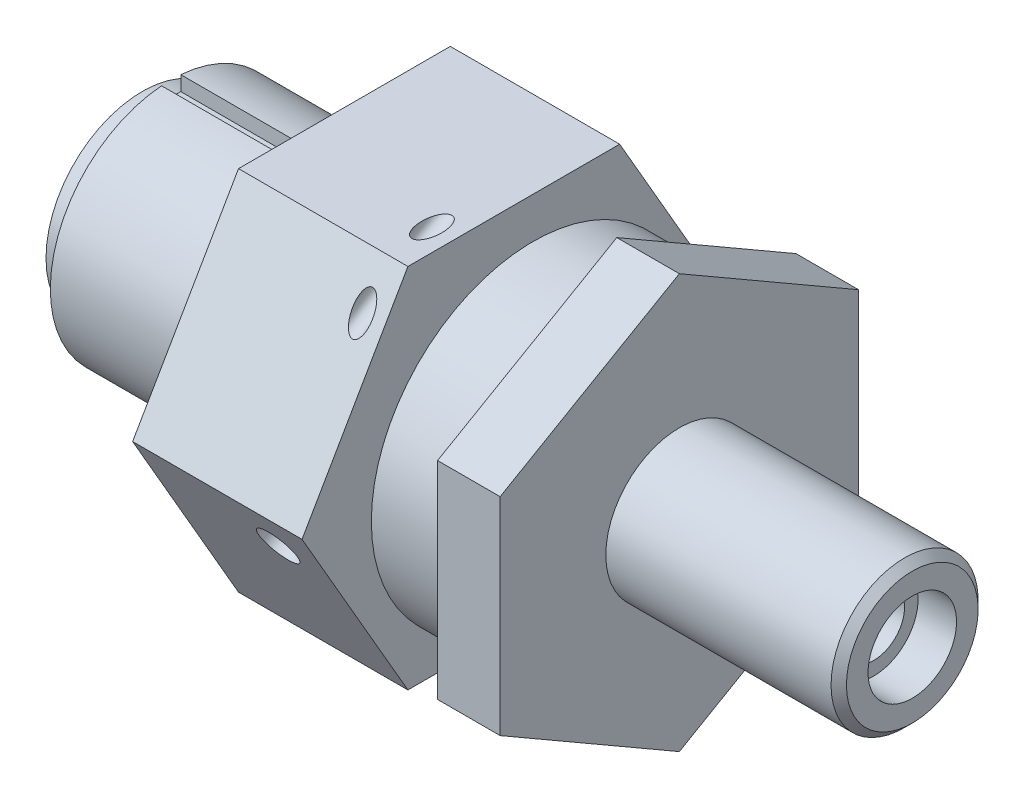
ISO-10303-21;
HEADER;
FILE_DESCRIPTION(('STEP AP214'),'2;1');
FILE_NAME('part.step','',(''),(''),'','','');
FILE_SCHEMA(('AUTOMOTIVE_DESIGN { 1 0 10303 214 1 1 1 1 }'));
ENDSEC;
DATA;
#1=APPLICATION_CONTEXT('core data for automotive mechanical design processes');
#2=APPLICATION_PROTOCOL_DEFINITION('international standard','automotive_design',2000,#1);
#3=PRODUCT_CONTEXT('',#1,'mechanical');
#4=PRODUCT('Part','Part','',(#3));
#5=PRODUCT_RELATED_PRODUCT_CATEGORY('part','',(#4));
#6=PRODUCT_DEFINITION_FORMATION('','',#4);
#7=PRODUCT_DEFINITION_CONTEXT('part definition',#1,'design');
#8=PRODUCT_DEFINITION('design','',#6,#7);
#9=PRODUCT_DEFINITION_SHAPE('','',#8);
#10=(LENGTH_UNIT() NAMED_UNIT(*) SI_UNIT(.MILLI.,.METRE.));
#11=(NAMED_UNIT(*) PLANE_ANGLE_UNIT() SI_UNIT($,.RADIAN.));
#12=(NAMED_UNIT(*) SI_UNIT($,.STERADIAN.) SOLID_ANGLE_UNIT());
#13=UNCERTAINTY_MEASURE_WITH_UNIT(LENGTH_MEASURE(1.E-05),#10,'distance_accuracy_value','');
#14=(GEOMETRIC_REPRESENTATION_CONTEXT(3) GLOBAL_UNCERTAINTY_ASSIGNED_CONTEXT((#13)) GLOBAL_UNIT_ASSIGNED_CONTEXT((#10,
#11,#12)) REPRESENTATION_CONTEXT('',''));
#15=CARTESIAN_POINT('',(0.,0.,0.));
#16=DIRECTION('',(0.,0.,1.));
#17=DIRECTION('',(1.,0.,0.));
#18=AXIS2_PLACEMENT_3D('',#15,#16,#17);
#19=CARTESIAN_POINT('',(10.5,8.75,0.));
#20=DIRECTION('',(1.,0.,0.));
#21=DIRECTION('',(0.,0.,-1.));
#22=AXIS2_PLACEMENT_3D('',#19,#20,#21);
#23=PLANE('',#22);
#24=CARTESIAN_POINT('',(10.5,0.,0.));
#25=DIRECTION('',(-1.,0.,0.));
#26=DIRECTION('',(0.,0.,1.));
#27=AXIS2_PLACEMENT_3D('',#24,#25,#26);
#28=CIRCLE('',#27,8.75);
#29=CARTESIAN_POINT('',(10.5,0.,8.75));
#30=VERTEX_POINT('',#29);
#31=EDGE_CURVE('E322',#30,#30,#28,.T.);
#32=ORIENTED_EDGE('',*,*,#31,.F.);
#33=EDGE_LOOP('',(#32));
#34=FACE_BOUND('',#33,.T.);
#35=DIRECTION('',(0.,-0.866025403784439,-0.5));
#36=VECTOR('',#35,1.);
#37=CARTESIAN_POINT('',(10.5,0.,-11.));
#38=LINE('',#37,#36);
#39=CARTESIAN_POINT('',(10.5,9.52627944162882,-5.5));
#40=VERTEX_POINT('',#39);
#41=CARTESIAN_POINT('',(10.5,0.,-11.));
#42=VERTEX_POINT('',#41);
#43=EDGE_CURVE('E198',#40,#42,#38,.T.);
#44=ORIENTED_EDGE('',*,*,#43,.T.);
#45=DIRECTION('',(0.,-0.866025403784439,0.5));
#46=VECTOR('',#45,1.);
#47=CARTESIAN_POINT('',(10.5,-9.52627944162883,-5.5));
#48=LINE('',#47,#46);
#49=CARTESIAN_POINT('',(10.5,-9.52627944162883,-5.5));
#50=VERTEX_POINT('',#49);
#51=EDGE_CURVE('E236',#42,#50,#48,.T.);
#52=ORIENTED_EDGE('',*,*,#51,.T.);
#53=DIRECTION('',(0.,0.,1.));
#54=VECTOR('',#53,1.);
#55=CARTESIAN_POINT('',(10.5,-9.52627944162883,5.49999999999999));
#56=LINE('',#55,#54);
#57=CARTESIAN_POINT('',(10.5,-9.52627944162883,5.49999999999999));
#58=VERTEX_POINT('',#57);
#59=EDGE_CURVE('E222',#50,#58,#56,.T.);
#60=ORIENTED_EDGE('',*,*,#59,.T.);
#61=DIRECTION('',(0.,0.866025403784438,0.5));
#62=VECTOR('',#61,1.);
#63=CARTESIAN_POINT('',(10.5,0.,11.));
#64=LINE('',#63,#62);
#65=CARTESIAN_POINT('',(10.5,0.,11.));
#66=VERTEX_POINT('',#65);
#67=EDGE_CURVE('E202',#58,#66,#64,.T.);
#68=ORIENTED_EDGE('',*,*,#67,.T.);
#69=DIRECTION('',(0.,0.866025403784439,-0.5));
#70=VECTOR('',#69,1.);
#71=CARTESIAN_POINT('',(10.5,9.52627944162882,5.5));
#72=LINE('',#71,#70);
#73=CARTESIAN_POINT('',(10.5,9.52627944162882,5.5));
#74=VERTEX_POINT('',#73);
#75=EDGE_CURVE('E213',#66,#74,#72,.T.);
#76=ORIENTED_EDGE('',*,*,#75,.T.);
#77=DIRECTION('',(0.,0.,-1.));
#78=VECTOR('',#77,1.);
#79=CARTESIAN_POINT('',(10.5,9.52627944162882,-5.5));
#80=LINE('',#79,#78);
#81=EDGE_CURVE('E218',#74,#40,#80,.T.);
#82=ORIENTED_EDGE('',*,*,#81,.T.);
#83=EDGE_LOOP('',(#44,#52,#60,#68,#76,#82));
#84=FACE_BOUND('',#83,.T.);
#85=ADVANCED_FACE('F43',(#34,#84),#23,.F.);
#86=CARTESIAN_POINT('',(19.3,11.,0.));
#87=DIRECTION('',(-1.,0.,0.));
#88=DIRECTION('',(0.,0.,1.));
#89=AXIS2_PLACEMENT_3D('',#86,#87,#88);
#90=PLANE('',#89);
#91=CARTESIAN_POINT('',(19.3,0.,0.));
#92=DIRECTION('',(-1.,0.,0.));
#93=DIRECTION('',(0.,0.,1.));
#94=AXIS2_PLACEMENT_3D('',#91,#92,#93);
#95=CIRCLE('',#94,6.5);
#96=CARTESIAN_POINT('',(19.3,0.,6.5));
#97=VERTEX_POINT('',#96);
#98=EDGE_CURVE('E319',#97,#97,#95,.T.);
#99=ORIENTED_EDGE('',*,*,#98,.T.);
#100=EDGE_LOOP('',(#99));
#101=FACE_BOUND('',#100,.T.);
#102=DIRECTION('',(0.,0.866025403784439,0.5));
#103=VECTOR('',#102,1.);
#104=CARTESIAN_POINT('',(19.3,0.,-11.));
#105=LINE('',#104,#103);
#106=CARTESIAN_POINT('',(19.3,0.,-11.));
#107=VERTEX_POINT('',#106);
#108=CARTESIAN_POINT('',(19.3,9.52627944162883,-5.5));
#109=VERTEX_POINT('',#108);
#110=EDGE_CURVE('E194',#107,#109,#105,.T.);
#111=ORIENTED_EDGE('',*,*,#110,.T.);
#112=DIRECTION('',(0.,0.,1.));
#113=VECTOR('',#112,1.);
#114=CARTESIAN_POINT('',(19.3,9.52627944162882,-5.5));
#115=LINE('',#114,#113);
#116=CARTESIAN_POINT('',(19.3,9.52627944162882,5.5));
#117=VERTEX_POINT('',#116);
#118=EDGE_CURVE('E219',#109,#117,#115,.T.);
#119=ORIENTED_EDGE('',*,*,#118,.T.);
#120=DIRECTION('',(0.,-0.866025403784439,0.5));
#121=VECTOR('',#120,1.);
#122=CARTESIAN_POINT('',(19.3,9.52627944162882,5.5));
#123=LINE('',#122,#121);
#124=CARTESIAN_POINT('',(19.3,0.,11.));
#125=VERTEX_POINT('',#124);
#126=EDGE_CURVE('E67',#117,#125,#123,.T.);
#127=ORIENTED_EDGE('',*,*,#126,.T.);
#128=DIRECTION('',(0.,-0.866025403784438,-0.5));
#129=VECTOR('',#128,1.);
#130=CARTESIAN_POINT('',(19.3,0.,11.));
#131=LINE('',#130,#129);
#132=CARTESIAN_POINT('',(19.3,-9.52627944162883,5.49999999999999));
#133=VERTEX_POINT('',#132);
#134=EDGE_CURVE('E205',#125,#133,#131,.T.);
#135=ORIENTED_EDGE('',*,*,#134,.T.);
#136=DIRECTION('',(0.,0.,-1.));
#137=VECTOR('',#136,1.);
#138=CARTESIAN_POINT('',(19.3,-9.52627944162883,5.49999999999999));
#139=LINE('',#138,#137);
#140=CARTESIAN_POINT('',(19.3,-9.52627944162883,-5.5));
#141=VERTEX_POINT('',#140);
#142=EDGE_CURVE('E229',#133,#141,#139,.T.);
#143=ORIENTED_EDGE('',*,*,#142,.T.);
#144=DIRECTION('',(0.,0.866025403784439,-0.5));
#145=VECTOR('',#144,1.);
#146=CARTESIAN_POINT('',(19.3,-9.52627944162883,-5.5));
#147=LINE('',#146,#145);
#148=EDGE_CURVE('E239',#141,#107,#147,.T.);
#149=ORIENTED_EDGE('',*,*,#148,.T.);
#150=EDGE_LOOP('',(#111,#119,#127,#135,#143,#149));
#151=FACE_BOUND('',#150,.T.);
#152=ADVANCED_FACE('F363',(#101,#151),#90,.F.);
#153=CARTESIAN_POINT('',(24.65,8.4,0.));
#154=DIRECTION('',(1.,0.,0.));
#155=DIRECTION('',(0.,0.,-1.));
#156=AXIS2_PLACEMENT_3D('',#153,#154,#155);
#157=PLANE('',#156);
#158=CARTESIAN_POINT('',(24.65,0.,0.));
#159=DIRECTION('',(-1.,0.,0.));
#160=DIRECTION('',(0.,0.,1.));
#161=AXIS2_PLACEMENT_3D('',#158,#159,#160);
#162=CIRCLE('',#161,8.4);
#163=CARTESIAN_POINT('',(24.65,0.,8.4));
#164=VERTEX_POINT('',#163);
#165=EDGE_CURVE('E310',#164,#164,#162,.T.);
#166=ORIENTED_EDGE('',*,*,#165,.F.);
#167=EDGE_LOOP('',(#166));
#168=FACE_BOUND('',#167,.T.);
#169=DIRECTION('',(0.,-1.,0.));
#170=VECTOR('',#169,1.);
#171=CARTESIAN_POINT('',(24.65,-5.375,-9.30977309068271));
#172=LINE('',#171,#170);
#173=CARTESIAN_POINT('',(24.65,5.375,-9.30977309068271));
#174=VERTEX_POINT('',#173);
#175=CARTESIAN_POINT('',(24.65,-5.375,-9.30977309068271));
#176=VERTEX_POINT('',#175);
#177=EDGE_CURVE('E247',#174,#176,#172,.T.);
#178=ORIENTED_EDGE('',*,*,#177,.T.);
#179=DIRECTION('',(0.,-0.5,0.866025403784439));
#180=VECTOR('',#179,1.);
#181=CARTESIAN_POINT('',(24.65,-10.75,0.));
#182=LINE('',#181,#180);
#183=CARTESIAN_POINT('',(24.65,-10.75,0.));
#184=VERTEX_POINT('',#183);
#185=EDGE_CURVE('E289',#176,#184,#182,.T.);
#186=ORIENTED_EDGE('',*,*,#185,.T.);
#187=DIRECTION('',(0.,0.5,0.866025403784439));
#188=VECTOR('',#187,1.);
#189=CARTESIAN_POINT('',(24.65,-5.375,9.30977309068271));
#190=LINE('',#189,#188);
#191=CARTESIAN_POINT('',(24.65,-5.37500000000001,9.30977309068271));
#192=VERTEX_POINT('',#191);
#193=EDGE_CURVE('E272',#184,#192,#190,.T.);
#194=ORIENTED_EDGE('',*,*,#193,.T.);
#195=DIRECTION('',(0.,1.,0.));
#196=VECTOR('',#195,1.);
#197=CARTESIAN_POINT('',(24.65,5.375,9.30977309068271));
#198=LINE('',#197,#196);
#199=CARTESIAN_POINT('',(24.65,5.375,9.30977309068272));
#200=VERTEX_POINT('',#199);
#201=EDGE_CURVE('E251',#192,#200,#198,.T.);
#202=ORIENTED_EDGE('',*,*,#201,.T.);
#203=DIRECTION('',(0.,0.5,-0.866025403784438));
#204=VECTOR('',#203,1.);
#205=CARTESIAN_POINT('',(24.65,10.75,0.));
#206=LINE('',#205,#204);
#207=CARTESIAN_POINT('',(24.65,10.75,0.));
#208=VERTEX_POINT('',#207);
#209=EDGE_CURVE('E262',#200,#208,#206,.T.);
#210=ORIENTED_EDGE('',*,*,#209,.T.);
#211=DIRECTION('',(0.,-0.5,-0.866025403784439));
#212=VECTOR('',#211,1.);
#213=CARTESIAN_POINT('',(24.65,5.375,-9.30977309068271));
#214=LINE('',#213,#212);
#215=EDGE_CURVE('E273',#208,#174,#214,.T.);
#216=ORIENTED_EDGE('',*,*,#215,.T.);
#217=EDGE_LOOP('',(#178,#186,#194,#202,#210,#216));
#218=FACE_BOUND('',#217,.T.);
#219=ADVANCED_FACE('F370',(#168,#218),#157,.F.);
#220=CARTESIAN_POINT('',(27.9,10.75,0.));
#221=DIRECTION('',(-1.,0.,0.));
#222=DIRECTION('',(0.,0.,1.));
#223=AXIS2_PLACEMENT_3D('',#220,#221,#222);
#224=PLANE('',#223);
#225=CARTESIAN_POINT('',(27.9,0.,0.));
#226=DIRECTION('',(-1.,0.,0.));
#227=DIRECTION('',(0.,0.,1.));
#228=AXIS2_PLACEMENT_3D('',#225,#226,#227);
#229=CIRCLE('',#228,3.82);
#230=CARTESIAN_POINT('',(27.9,0.,3.82));
#231=VERTEX_POINT('',#230);
#232=EDGE_CURVE('E307',#231,#231,#229,.T.);
#233=ORIENTED_EDGE('',*,*,#232,.T.);
#234=EDGE_LOOP('',(#233));
#235=FACE_BOUND('',#234,.T.);
#236=DIRECTION('',(0.,1.,0.));
#237=VECTOR('',#236,1.);
#238=CARTESIAN_POINT('',(27.9,-5.375,-9.30977309068271));
#239=LINE('',#238,#237);
#240=CARTESIAN_POINT('',(27.9,-5.375,-9.30977309068271));
#241=VERTEX_POINT('',#240);
#242=CARTESIAN_POINT('',(27.9,5.375,-9.30977309068271));
#243=VERTEX_POINT('',#242);
#244=EDGE_CURVE('E243',#241,#243,#239,.T.);
#245=ORIENTED_EDGE('',*,*,#244,.T.);
#246=DIRECTION('',(0.,0.5,0.866025403784439));
#247=VECTOR('',#246,1.);
#248=CARTESIAN_POINT('',(27.9,5.375,-9.30977309068271));
#249=LINE('',#248,#247);
#250=CARTESIAN_POINT('',(27.9,10.75,0.));
#251=VERTEX_POINT('',#250);
#252=EDGE_CURVE('E269',#243,#251,#249,.T.);
#253=ORIENTED_EDGE('',*,*,#252,.T.);
#254=DIRECTION('',(0.,-0.5,0.866025403784439));
#255=VECTOR('',#254,1.);
#256=CARTESIAN_POINT('',(27.9,10.75,0.));
#257=LINE('',#256,#255);
#258=CARTESIAN_POINT('',(27.9,5.37499999999999,9.30977309068272));
#259=VERTEX_POINT('',#258);
#260=EDGE_CURVE('E263',#251,#259,#257,.T.);
#261=ORIENTED_EDGE('',*,*,#260,.T.);
#262=DIRECTION('',(0.,-1.,0.));
#263=VECTOR('',#262,1.);
#264=CARTESIAN_POINT('',(27.9,5.375,9.30977309068271));
#265=LINE('',#264,#263);
#266=CARTESIAN_POINT('',(27.9,-5.375,9.30977309068271));
#267=VERTEX_POINT('',#266);
#268=EDGE_CURVE('E254',#259,#267,#265,.T.);
#269=ORIENTED_EDGE('',*,*,#268,.T.);
#270=DIRECTION('',(0.,-0.5,-0.866025403784439));
#271=VECTOR('',#270,1.);
#272=CARTESIAN_POINT('',(27.9,-5.375,9.30977309068271));
#273=LINE('',#272,#271);
#274=CARTESIAN_POINT('',(27.9,-10.75,0.));
#275=VERTEX_POINT('',#274);
#276=EDGE_CURVE('E282',#267,#275,#273,.T.);
#277=ORIENTED_EDGE('',*,*,#276,.T.);
#278=DIRECTION('',(0.,0.5,-0.866025403784439));
#279=VECTOR('',#278,1.);
#280=CARTESIAN_POINT('',(27.9,-10.75,0.));
#281=LINE('',#280,#279);
#282=EDGE_CURVE('E292',#275,#241,#281,.T.);
#283=ORIENTED_EDGE('',*,*,#282,.T.);
#284=EDGE_LOOP('',(#245,#253,#261,#269,#277,#283));
#285=FACE_BOUND('',#284,.T.);
#286=ADVANCED_FACE('F397',(#235,#285),#224,.F.);
#287=CARTESIAN_POINT('',(0.,0.,0.));
#288=DIRECTION('',(1.,0.,0.));
#289=DIRECTION('',(0.,0.,-1.));
#290=AXIS2_PLACEMENT_3D('',#287,#288,#289);
#291=PLANE('',#290);
#292=CARTESIAN_POINT('',(0.,0.,0.));
#293=DIRECTION('',(-1.,0.,0.));
#294=DIRECTION('',(0.,0.,1.));
#295=AXIS2_PLACEMENT_3D('',#292,#293,#294);
#296=CIRCLE('',#295,5.);
#297=CARTESIAN_POINT('',(0.,0.,5.));
#298=VERTEX_POINT('',#297);
#299=EDGE_CURVE('E336',#298,#298,#296,.T.);
#300=ORIENTED_EDGE('',*,*,#299,.T.);
#301=EDGE_LOOP('',(#300));
#302=FACE_BOUND('',#301,.T.);
#303=ADVANCED_FACE('F394',(#302),#291,.F.);
#304=CARTESIAN_POINT('',(0.,0.,0.));
#305=DIRECTION('',(-1.,0.,0.));
#306=DIRECTION('',(0.,0.,1.));
#307=AXIS2_PLACEMENT_3D('',#304,#305,#306);
#308=CYLINDRICAL_SURFACE('',#307,5.);
#309=ORIENTED_EDGE('',*,*,#299,.F.);
#310=EDGE_LOOP('',(#309));
#311=FACE_BOUND('',#310,.T.);
#312=CARTESIAN_POINT('',(1.5,0.,0.));
#313=DIRECTION('',(-1.,0.,0.));
#314=DIRECTION('',(0.,0.,1.));
#315=AXIS2_PLACEMENT_3D('',#312,#313,#314);
#316=CIRCLE('',#315,5.);
#317=CARTESIAN_POINT('',(1.5,0.,5.));
#318=VERTEX_POINT('',#317);
#319=EDGE_CURVE('E333',#318,#318,#316,.T.);
#320=ORIENTED_EDGE('',*,*,#319,.T.);
#321=EDGE_LOOP('',(#320));
#322=FACE_BOUND('',#321,.T.);
#323=ADVANCED_FACE('F391',(#311,#322),#308,.T.);
#324=CARTESIAN_POINT('',(1.5,5.,0.));
#325=DIRECTION('',(1.,0.,0.));
#326=DIRECTION('',(0.,0.,-1.));
#327=AXIS2_PLACEMENT_3D('',#324,#325,#326);
#328=PLANE('',#327);
#329=ORIENTED_EDGE('',*,*,#319,.F.);
#330=EDGE_LOOP('',(#329));
#331=FACE_BOUND('',#330,.T.);
#332=CARTESIAN_POINT('',(1.5,0.,0.));
#333=DIRECTION('',(-1.,0.,0.));
#334=DIRECTION('',(0.,0.,1.));
#335=AXIS2_PLACEMENT_3D('',#332,#333,#334);
#336=CIRCLE('',#335,6.275);
#337=CARTESIAN_POINT('',(1.5,6.25504796144682,-0.5));
#338=VERTEX_POINT('',#337);
#339=CARTESIAN_POINT('',(1.5,6.25504796144682,0.5));
#340=VERTEX_POINT('',#339);
#341=EDGE_CURVE('E330',#338,#340,#336,.T.);
#342=ORIENTED_EDGE('',*,*,#341,.T.);
#343=DIRECTION('',(0.,1.,0.));
#344=VECTOR('',#343,1.);
#345=CARTESIAN_POINT('',(1.5,6.6358415032681,0.5));
#346=LINE('',#345,#344);
#347=CARTESIAN_POINT('',(1.5,5.49119751435941,0.5));
#348=VERTEX_POINT('',#347);
#349=EDGE_CURVE('E180',#348,#340,#346,.T.);
#350=ORIENTED_EDGE('',*,*,#349,.F.);
#351=DIRECTION('',(0.,0.,1.));
#352=VECTOR('',#351,1.);
#353=CARTESIAN_POINT('',(1.5,5.49119751435941,-0.5));
#354=LINE('',#353,#352);
#355=CARTESIAN_POINT('',(1.5,5.49119751435941,-0.5));
#356=VERTEX_POINT('',#355);
#357=EDGE_CURVE('E175',#356,#348,#354,.T.);
#358=ORIENTED_EDGE('',*,*,#357,.F.);
#359=DIRECTION('',(0.,-1.,0.));
#360=VECTOR('',#359,1.);
#361=CARTESIAN_POINT('',(1.5,6.6358415032681,-0.5));
#362=LINE('',#361,#360);
#363=EDGE_CURVE('E185',#338,#356,#362,.T.);
#364=ORIENTED_EDGE('',*,*,#363,.F.);
#365=EDGE_LOOP('',(#342,#350,#358,#364));
#366=FACE_BOUND('',#365,.T.);
#367=ADVANCED_FACE('F387',(#331,#366),#328,.F.);
#368=CARTESIAN_POINT('',(0.,0.,0.));
#369=DIRECTION('',(-1.,0.,0.));
#370=DIRECTION('',(0.,0.,1.));
#371=AXIS2_PLACEMENT_3D('',#368,#369,#370);
#372=CYLINDRICAL_SURFACE('',#371,6.275);
#373=CARTESIAN_POINT('',(11.,0.,0.));
#374=DIRECTION('',(-1.,0.,0.));
#375=DIRECTION('',(0.,0.,1.));
#376=AXIS2_PLACEMENT_3D('',#373,#374,#375);
#377=CIRCLE('',#376,6.275);
#378=CARTESIAN_POINT('',(11.,6.25504796144682,-0.5));
#379=VERTEX_POINT('',#378);
#380=CARTESIAN_POINT('',(11.,6.25504796144682,0.5));
#381=VERTEX_POINT('',#380);
#382=EDGE_CURVE('E328',#379,#381,#377,.T.);
#383=ORIENTED_EDGE('',*,*,#382,.T.);
#384=DIRECTION('',(-1.,0.,0.));
#385=VECTOR('',#384,1.);
#386=CARTESIAN_POINT('',(0.,6.25504796144682,0.5));
#387=LINE('',#386,#385);
#388=EDGE_CURVE('E163',#381,#340,#387,.T.);
#389=ORIENTED_EDGE('',*,*,#388,.T.);
#390=ORIENTED_EDGE('',*,*,#341,.F.);
#391=DIRECTION('',(-1.,0.,0.));
#392=VECTOR('',#391,1.);
#393=CARTESIAN_POINT('',(0.,6.25504796144682,-0.5));
#394=LINE('',#393,#392);
#395=EDGE_CURVE('E190',#338,#379,#394,.F.);
#396=ORIENTED_EDGE('',*,*,#395,.T.);
#397=EDGE_LOOP('',(#383,#389,#390,#396));
#398=FACE_BOUND('',#397,.T.);
#399=ADVANCED_FACE('F384',(#398),#372,.T.);
#400=CARTESIAN_POINT('',(11.,6.275,0.));
#401=DIRECTION('',(1.,0.,0.));
#402=DIRECTION('',(0.,0.,-1.));
#403=AXIS2_PLACEMENT_3D('',#400,#401,#402);
#404=PLANE('',#403);
#405=ORIENTED_EDGE('',*,*,#382,.F.);
#406=DIRECTION('',(0.,-1.,0.));
#407=VECTOR('',#406,1.);
#408=CARTESIAN_POINT('',(11.,6.6358415032681,-0.5));
#409=LINE('',#408,#407);
#410=CARTESIAN_POINT('',(11.,5.49119751435941,-0.5));
#411=VERTEX_POINT('',#410);
#412=EDGE_CURVE('E59',#379,#411,#409,.T.);
#413=ORIENTED_EDGE('',*,*,#412,.T.);
#414=DIRECTION('',(0.,0.,1.));
#415=VECTOR('',#414,1.);
#416=CARTESIAN_POINT('',(11.,5.49119751435941,-0.5));
#417=LINE('',#416,#415);
#418=CARTESIAN_POINT('',(11.,5.49119751435941,0.5));
#419=VERTEX_POINT('',#418);
#420=EDGE_CURVE('E173',#411,#419,#417,.T.);
#421=ORIENTED_EDGE('',*,*,#420,.T.);
#422=DIRECTION('',(0.,1.,0.));
#423=VECTOR('',#422,1.);
#424=CARTESIAN_POINT('',(11.,6.6358415032681,0.5));
#425=LINE('',#424,#423);
#426=EDGE_CURVE('E157',#419,#381,#425,.T.);
#427=ORIENTED_EDGE('',*,*,#426,.T.);
#428=EDGE_LOOP('',(#405,#413,#421,#427));
#429=FACE_BOUND('',#428,.T.);
#430=CARTESIAN_POINT('',(11.,0.,0.));
#431=DIRECTION('',(-1.,0.,0.));
#432=DIRECTION('',(0.,0.,1.));
#433=AXIS2_PLACEMENT_3D('',#430,#431,#432);
#434=CIRCLE('',#433,8.75);
#435=CARTESIAN_POINT('',(11.,0.,8.75));
#436=VERTEX_POINT('',#435);
#437=EDGE_CURVE('E325',#436,#436,#434,.T.);
#438=ORIENTED_EDGE('',*,*,#437,.T.);
#439=EDGE_LOOP('',(#438));
#440=FACE_BOUND('',#439,.T.);
#441=ADVANCED_FACE('F178',(#429,#440),#404,.F.);
#442=CARTESIAN_POINT('',(0.,0.,0.));
#443=DIRECTION('',(-1.,0.,0.));
#444=DIRECTION('',(0.,0.,1.));
#445=AXIS2_PLACEMENT_3D('',#442,#443,#444);
#446=CYLINDRICAL_SURFACE('',#445,8.75);
#447=ORIENTED_EDGE('',*,*,#437,.F.);
#448=EDGE_LOOP('',(#447));
#449=FACE_BOUND('',#448,.T.);
#450=ORIENTED_EDGE('',*,*,#31,.T.);
#451=EDGE_LOOP('',(#450));
#452=FACE_BOUND('',#451,.T.);
#453=ADVANCED_FACE('F377',(#449,#452),#446,.F.);
#454=CARTESIAN_POINT('',(0.,0.,0.));
#455=DIRECTION('',(-1.,0.,0.));
#456=DIRECTION('',(0.,0.,1.));
#457=AXIS2_PLACEMENT_3D('',#454,#455,#456);
#458=CYLINDRICAL_SURFACE('',#457,6.5);
#459=ORIENTED_EDGE('',*,*,#98,.F.);
#460=EDGE_LOOP('',(#459));
#461=FACE_BOUND('',#460,.T.);
#462=CARTESIAN_POINT('',(20.3,0.,0.));
#463=DIRECTION('',(-1.,0.,0.));
#464=DIRECTION('',(0.,0.,1.));
#465=AXIS2_PLACEMENT_3D('',#462,#463,#464);
#466=CIRCLE('',#465,6.5);
#467=CARTESIAN_POINT('',(20.3,0.,6.5));
#468=VERTEX_POINT('',#467);
#469=EDGE_CURVE('E316',#468,#468,#466,.T.);
#470=ORIENTED_EDGE('',*,*,#469,.T.);
#471=EDGE_LOOP('',(#470));
#472=FACE_BOUND('',#471,.T.);
#473=ADVANCED_FACE('F380',(#461,#472),#458,.T.);
#474=CARTESIAN_POINT('',(20.3,6.5,0.));
#475=DIRECTION('',(1.,0.,0.));
#476=DIRECTION('',(0.,0.,-1.));
#477=AXIS2_PLACEMENT_3D('',#474,#475,#476);
#478=PLANE('',#477);
#479=ORIENTED_EDGE('',*,*,#469,.F.);
#480=EDGE_LOOP('',(#479));
#481=FACE_BOUND('',#480,.T.);
#482=CARTESIAN_POINT('',(20.3,0.,0.));
#483=DIRECTION('',(-1.,0.,0.));
#484=DIRECTION('',(0.,0.,1.));
#485=AXIS2_PLACEMENT_3D('',#482,#483,#484);
#486=CIRCLE('',#485,8.4);
#487=CARTESIAN_POINT('',(20.3,0.,8.4));
#488=VERTEX_POINT('',#487);
#489=EDGE_CURVE('E313',#488,#488,#486,.T.);
#490=ORIENTED_EDGE('',*,*,#489,.T.);
#491=EDGE_LOOP('',(#490));
#492=FACE_BOUND('',#491,.T.);
#493=ADVANCED_FACE('F505',(#481,#492),#478,.F.);
#494=CARTESIAN_POINT('',(0.,0.,0.));
#495=DIRECTION('',(-1.,0.,0.));
#496=DIRECTION('',(0.,0.,1.));
#497=AXIS2_PLACEMENT_3D('',#494,#495,#496);
#498=CYLINDRICAL_SURFACE('',#497,8.4);
#499=ORIENTED_EDGE('',*,*,#489,.F.);
#500=EDGE_LOOP('',(#499));
#501=FACE_BOUND('',#500,.T.);
#502=ORIENTED_EDGE('',*,*,#165,.T.);
#503=EDGE_LOOP('',(#502));
#504=FACE_BOUND('',#503,.T.);
#505=ADVANCED_FACE('F499',(#501,#504),#498,.T.);
#506=CARTESIAN_POINT('',(0.,0.,0.));
#507=DIRECTION('',(-1.,0.,0.));
#508=DIRECTION('',(0.,0.,1.));
#509=AXIS2_PLACEMENT_3D('',#506,#507,#508);
#510=CYLINDRICAL_SURFACE('',#509,3.82);
#511=CARTESIAN_POINT('',(39.6,0.,0.));
#512=DIRECTION('',(-1.,0.,0.));
#513=DIRECTION('',(0.,0.,1.));
#514=AXIS2_PLACEMENT_3D('',#511,#512,#513);
#515=CIRCLE('',#514,3.82);
#516=CARTESIAN_POINT('',(39.6,0.,3.82));
#517=VERTEX_POINT('',#516);
#518=EDGE_CURVE('E52',#517,#517,#515,.T.);
#519=ORIENTED_EDGE('',*,*,#518,.T.);
#520=EDGE_LOOP('',(#519));
#521=FACE_BOUND('',#520,.T.);
#522=ORIENTED_EDGE('',*,*,#232,.F.);
#523=EDGE_LOOP('',(#522));
#524=FACE_BOUND('',#523,.T.);
#525=ADVANCED_FACE('F342',(#521,#524),#510,.T.);
#526=CARTESIAN_POINT('',(40.,3.82,0.));
#527=DIRECTION('',(-1.,0.,0.));
#528=DIRECTION('',(0.,0.,1.));
#529=AXIS2_PLACEMENT_3D('',#526,#527,#528);
#530=PLANE('',#529);
#531=CARTESIAN_POINT('',(40.,0.,0.));
#532=DIRECTION('',(-1.,0.,0.));
#533=DIRECTION('',(0.,0.,1.));
#534=AXIS2_PLACEMENT_3D('',#531,#532,#533);
#535=CIRCLE('',#534,3.41999999999999);
#536=CARTESIAN_POINT('',(40.,0.,3.41999999999999));
#537=VERTEX_POINT('',#536);
#538=EDGE_CURVE('E11',#537,#537,#535,.F.);
#539=ORIENTED_EDGE('',*,*,#538,.T.);
#540=EDGE_LOOP('',(#539));
#541=FACE_BOUND('',#540,.T.);
#542=CARTESIAN_POINT('',(40.,0.,0.));
#543=DIRECTION('',(-1.,0.,0.));
#544=DIRECTION('',(0.,0.,1.));
#545=AXIS2_PLACEMENT_3D('',#542,#543,#544);
#546=CIRCLE('',#545,2.3);
#547=CARTESIAN_POINT('',(40.,0.,2.3));
#548=VERTEX_POINT('',#547);
#549=EDGE_CURVE('E304',#548,#548,#546,.T.);
#550=ORIENTED_EDGE('',*,*,#549,.T.);
#551=EDGE_LOOP('',(#550));
#552=FACE_BOUND('',#551,.T.);
#553=ADVANCED_FACE('F494',(#541,#552),#530,.F.);
#554=CARTESIAN_POINT('',(0.,0.,0.));
#555=DIRECTION('',(-1.,0.,0.));
#556=DIRECTION('',(0.,0.,1.));
#557=AXIS2_PLACEMENT_3D('',#554,#555,#556);
#558=CYLINDRICAL_SURFACE('',#557,2.3);
#559=ORIENTED_EDGE('',*,*,#549,.F.);
#560=EDGE_LOOP('',(#559));
#561=FACE_BOUND('',#560,.T.);
#562=CARTESIAN_POINT('',(38.,0.,0.));
#563=DIRECTION('',(-1.,0.,0.));
#564=DIRECTION('',(0.,0.,1.));
#565=AXIS2_PLACEMENT_3D('',#562,#563,#564);
#566=CIRCLE('',#565,2.3);
#567=CARTESIAN_POINT('',(38.,0.,2.3));
#568=VERTEX_POINT('',#567);
#569=EDGE_CURVE('E301',#568,#568,#566,.T.);
#570=ORIENTED_EDGE('',*,*,#569,.T.);
#571=EDGE_LOOP('',(#570));
#572=FACE_BOUND('',#571,.T.);
#573=ADVANCED_FACE('F490',(#561,#572),#558,.F.);
#574=CARTESIAN_POINT('',(38.,2.3,0.));
#575=DIRECTION('',(-1.,0.,0.));
#576=DIRECTION('',(0.,0.,1.));
#577=AXIS2_PLACEMENT_3D('',#574,#575,#576);
#578=PLANE('',#577);
#579=ORIENTED_EDGE('',*,*,#569,.F.);
#580=EDGE_LOOP('',(#579));
#581=FACE_BOUND('',#580,.T.);
#582=CARTESIAN_POINT('',(38.,0.,0.));
#583=DIRECTION('',(-1.,0.,0.));
#584=DIRECTION('',(0.,0.,1.));
#585=AXIS2_PLACEMENT_3D('',#582,#583,#584);
#586=CIRCLE('',#585,1.6);
#587=CARTESIAN_POINT('',(38.,0.,1.6));
#588=VERTEX_POINT('',#587);
#589=EDGE_CURVE('E298',#588,#588,#586,.T.);
#590=ORIENTED_EDGE('',*,*,#589,.T.);
#591=EDGE_LOOP('',(#590));
#592=FACE_BOUND('',#591,.T.);
#593=ADVANCED_FACE('F486',(#581,#592),#578,.F.);
#594=CARTESIAN_POINT('',(0.,0.,0.));
#595=DIRECTION('',(-1.,0.,0.));
#596=DIRECTION('',(0.,0.,1.));
#597=AXIS2_PLACEMENT_3D('',#594,#595,#596);
#598=CYLINDRICAL_SURFACE('',#597,1.6);
#599=ORIENTED_EDGE('',*,*,#589,.F.);
#600=EDGE_LOOP('',(#599));
#601=FACE_BOUND('',#600,.T.);
#602=CARTESIAN_POINT('',(12.,0.,0.));
#603=DIRECTION('',(-1.,0.,0.));
#604=DIRECTION('',(0.,0.,1.));
#605=AXIS2_PLACEMENT_3D('',#602,#603,#604);
#606=CIRCLE('',#605,1.6);
#607=CARTESIAN_POINT('',(12.,0.,1.6));
#608=VERTEX_POINT('',#607);
#609=EDGE_CURVE('E295',#608,#608,#606,.T.);
#610=ORIENTED_EDGE('',*,*,#609,.T.);
#611=EDGE_LOOP('',(#610));
#612=FACE_BOUND('',#611,.T.);
#613=ADVANCED_FACE('F358',(#601,#612),#598,.F.);
#614=CARTESIAN_POINT('',(12.,1.6,0.));
#615=DIRECTION('',(-1.,0.,0.));
#616=DIRECTION('',(0.,0.,1.));
#617=AXIS2_PLACEMENT_3D('',#614,#615,#616);
#618=PLANE('',#617);
#619=ORIENTED_EDGE('',*,*,#609,.F.);
#620=EDGE_LOOP('',(#619));
#621=FACE_BOUND('',#620,.T.);
#622=ADVANCED_FACE('F347',(#621),#618,.F.);
#623=CARTESIAN_POINT('',(39.6,0.,0.));
#624=DIRECTION('',(-1.,0.,0.));
#625=DIRECTION('',(0.,0.,1.));
#626=AXIS2_PLACEMENT_3D('',#623,#624,#625);
#627=CONICAL_SURFACE('',#626,3.82,0.785398163397452);
#628=ORIENTED_EDGE('',*,*,#538,.F.);
#629=EDGE_LOOP('',(#628));
#630=FACE_BOUND('',#629,.T.);
#631=ORIENTED_EDGE('',*,*,#518,.F.);
#632=EDGE_LOOP('',(#631));
#633=FACE_BOUND('',#632,.T.);
#634=ADVANCED_FACE('F45',(#630,#633),#627,.T.);
#635=CARTESIAN_POINT('',(-0.001000000000001,-10.75,0.));
#636=DIRECTION('',(0.,-0.866025403784439,-0.5));
#637=DIRECTION('',(0.,0.5,-0.866025403784439));
#638=AXIS2_PLACEMENT_3D('',#635,#636,#637);
#639=PLANE('',#638);
#640=DIRECTION('',(-1.,0.,0.));
#641=VECTOR('',#640,1.);
#642=CARTESIAN_POINT('',(0.,-5.375,-9.30977309068271));
#643=LINE('',#642,#641);
#644=EDGE_CURVE('E246',#241,#176,#643,.T.);
#645=ORIENTED_EDGE('',*,*,#644,.F.);
#646=ORIENTED_EDGE('',*,*,#282,.F.);
#647=DIRECTION('',(-1.,0.,0.));
#648=VECTOR('',#647,1.);
#649=CARTESIAN_POINT('',(0.,-10.75,0.));
#650=LINE('',#649,#648);
#651=EDGE_CURVE('E281',#275,#184,#650,.T.);
#652=ORIENTED_EDGE('',*,*,#651,.T.);
#653=ORIENTED_EDGE('',*,*,#185,.F.);
#654=EDGE_LOOP('',(#645,#646,#652,#653));
#655=FACE_BOUND('',#654,.T.);
#656=ADVANCED_FACE('F346',(#655),#639,.T.);
#657=CARTESIAN_POINT('',(-0.001000000000001,-5.375,9.30977309068271));
#658=DIRECTION('',(0.,-0.866025403784439,0.5));
#659=DIRECTION('',(0.,-0.5,-0.866025403784439));
#660=AXIS2_PLACEMENT_3D('',#657,#658,#659);
#661=PLANE('',#660);
#662=ORIENTED_EDGE('',*,*,#651,.F.);
#663=ORIENTED_EDGE('',*,*,#276,.F.);
#664=DIRECTION('',(-1.,0.,0.));
#665=VECTOR('',#664,1.);
#666=CARTESIAN_POINT('',(0.,-5.37500000000001,9.30977309068271));
#667=LINE('',#666,#665);
#668=EDGE_CURVE('E278',#267,#192,#667,.T.);
#669=ORIENTED_EDGE('',*,*,#668,.T.);
#670=ORIENTED_EDGE('',*,*,#193,.F.);
#671=EDGE_LOOP('',(#662,#663,#669,#670));
#672=FACE_BOUND('',#671,.T.);
#673=ADVANCED_FACE('F354',(#672),#661,.T.);
#674=CARTESIAN_POINT('',(-0.001000000000001,5.375,-9.30977309068271));
#675=DIRECTION('',(0.,0.866025403784439,-0.5));
#676=DIRECTION('',(0.,0.5,0.866025403784439));
#677=AXIS2_PLACEMENT_3D('',#674,#675,#676);
#678=PLANE('',#677);
#679=DIRECTION('',(1.,0.,0.));
#680=VECTOR('',#679,1.);
#681=CARTESIAN_POINT('',(-0.001000000000001,10.75,0.));
#682=LINE('',#681,#680);
#683=EDGE_CURVE('E266',#208,#251,#682,.T.);
#684=ORIENTED_EDGE('',*,*,#683,.T.);
#685=ORIENTED_EDGE('',*,*,#252,.F.);
#686=DIRECTION('',(-1.,0.,0.));
#687=VECTOR('',#686,1.);
#688=CARTESIAN_POINT('',(0.,5.37500000000001,-9.30977309068271));
#689=LINE('',#688,#687);
#690=EDGE_CURVE('E242',#243,#174,#689,.T.);
#691=ORIENTED_EDGE('',*,*,#690,.T.);
#692=ORIENTED_EDGE('',*,*,#215,.F.);
#693=EDGE_LOOP('',(#684,#685,#691,#692));
#694=FACE_BOUND('',#693,.T.);
#695=ADVANCED_FACE('F476',(#694),#678,.T.);
#696=CARTESIAN_POINT('',(-0.001000000000001,10.75,0.));
#697=DIRECTION('',(0.,0.866025403784439,0.5));
#698=DIRECTION('',(0.,-0.5,0.866025403784438));
#699=AXIS2_PLACEMENT_3D('',#696,#697,#698);
#700=PLANE('',#699);
#701=DIRECTION('',(1.,0.,0.));
#702=VECTOR('',#701,1.);
#703=CARTESIAN_POINT('',(-0.001000000000001,5.375,9.30977309068271));
#704=LINE('',#703,#702);
#705=EDGE_CURVE('E257',#200,#259,#704,.T.);
#706=ORIENTED_EDGE('',*,*,#705,.T.);
#707=ORIENTED_EDGE('',*,*,#260,.F.);
#708=ORIENTED_EDGE('',*,*,#683,.F.);
#709=ORIENTED_EDGE('',*,*,#209,.F.);
#710=EDGE_LOOP('',(#706,#707,#708,#709));
#711=FACE_BOUND('',#710,.T.);
#712=ADVANCED_FACE('F472',(#711),#700,.T.);
#713=CARTESIAN_POINT('',(-0.001000000000001,5.375,9.30977309068271));
#714=DIRECTION('',(0.,0.,1.));
#715=DIRECTION('',(0.,-1.,0.));
#716=AXIS2_PLACEMENT_3D('',#713,#714,#715);
#717=PLANE('',#716);
#718=ORIENTED_EDGE('',*,*,#668,.F.);
#719=ORIENTED_EDGE('',*,*,#268,.F.);
#720=ORIENTED_EDGE('',*,*,#705,.F.);
#721=ORIENTED_EDGE('',*,*,#201,.F.);
#722=EDGE_LOOP('',(#718,#719,#720,#721));
#723=FACE_BOUND('',#722,.T.);
#724=ADVANCED_FACE('F465',(#723),#717,.T.);
#725=CARTESIAN_POINT('',(-0.001000000000001,-5.375,-9.30977309068271));
#726=DIRECTION('',(0.,0.,-1.));
#727=DIRECTION('',(-1.,0.,0.));
#728=AXIS2_PLACEMENT_3D('',#725,#726,#727);
#729=PLANE('',#728);
#730=ORIENTED_EDGE('',*,*,#690,.F.);
#731=ORIENTED_EDGE('',*,*,#244,.F.);
#732=ORIENTED_EDGE('',*,*,#644,.T.);
#733=ORIENTED_EDGE('',*,*,#177,.F.);
#734=EDGE_LOOP('',(#730,#731,#732,#733));
#735=FACE_BOUND('',#734,.T.);
#736=ADVANCED_FACE('F459',(#735),#729,.T.);
#737=CARTESIAN_POINT('',(-0.001000000000001,-9.52627944162883,-5.5));
#738=DIRECTION('',(0.,-0.5,-0.866025403784439));
#739=DIRECTION('',(0.,0.866025403784439,-0.5));
#740=AXIS2_PLACEMENT_3D('',#737,#738,#739);
#741=PLANE('',#740);
#742=DIRECTION('',(-1.,0.,0.));
#743=VECTOR('',#742,1.);
#744=CARTESIAN_POINT('',(0.,0.,-11.));
#745=LINE('',#744,#743);
#746=EDGE_CURVE('E197',#107,#42,#745,.T.);
#747=ORIENTED_EDGE('',*,*,#746,.F.);
#748=ORIENTED_EDGE('',*,*,#148,.F.);
#749=DIRECTION('',(-1.,0.,0.));
#750=VECTOR('',#749,1.);
#751=CARTESIAN_POINT('',(0.,-9.52627944162883,-5.5));
#752=LINE('',#751,#750);
#753=EDGE_CURVE('E228',#141,#50,#752,.T.);
#754=ORIENTED_EDGE('',*,*,#753,.T.);
#755=ORIENTED_EDGE('',*,*,#51,.F.);
#756=EDGE_LOOP('',(#747,#748,#754,#755));
#757=FACE_BOUND('',#756,.T.);
#758=ADVANCED_FACE('F456',(#757),#741,.T.);
#759=CARTESIAN_POINT('',(-0.001000000000001,-9.52627944162883,5.49999999999999));
#760=DIRECTION('',(0.,-1.,0.));
#761=DIRECTION('',(0.,0.,-1.));
#762=AXIS2_PLACEMENT_3D('',#759,#760,#761);
#763=PLANE('',#762);
#764=ORIENTED_EDGE('',*,*,#753,.F.);
#765=ORIENTED_EDGE('',*,*,#142,.F.);
#766=DIRECTION('',(-1.,0.,0.));
#767=VECTOR('',#766,1.);
#768=CARTESIAN_POINT('',(0.,-9.52627944162883,5.49999999999999));
#769=LINE('',#768,#767);
#770=EDGE_CURVE('E225',#133,#58,#769,.T.);
#771=ORIENTED_EDGE('',*,*,#770,.T.);
#772=ORIENTED_EDGE('',*,*,#59,.F.);
#773=EDGE_LOOP('',(#764,#765,#771,#772));
#774=FACE_BOUND('',#773,.T.);
#775=ADVANCED_FACE('F454',(#774),#763,.T.);
#776=CARTESIAN_POINT('',(-0.001000000000001,9.52627944162882,-5.5));
#777=DIRECTION('',(0.,1.,0.));
#778=DIRECTION('',(0.,0.,1.));
#779=AXIS2_PLACEMENT_3D('',#776,#777,#778);
#780=PLANE('',#779);
#781=CARTESIAN_POINT('',(18.1459978536125,9.52627944162882,3.1));
#782=DIRECTION('',(0.,1.,0.));
#783=DIRECTION('',(0.,0.,1.));
#784=AXIS2_PLACEMENT_3D('',#781,#782,#783);
#785=ELLIPSE('',#784,1.04140766593159,0.520703832965796);
#786=CARTESIAN_POINT('',(18.1459978536125,9.52627944162882,4.14140766593159));
#787=VERTEX_POINT('',#786);
#788=EDGE_CURVE('E411',#787,#787,#785,.T.);
#789=ORIENTED_EDGE('',*,*,#788,.F.);
#790=EDGE_LOOP('',(#789));
#791=FACE_BOUND('',#790,.T.);
#792=DIRECTION('',(1.,0.,0.));
#793=VECTOR('',#792,1.);
#794=CARTESIAN_POINT('',(-0.001000000000001,9.52627944162882,5.5));
#795=LINE('',#794,#793);
#796=EDGE_CURVE('E212',#74,#117,#795,.T.);
#797=ORIENTED_EDGE('',*,*,#796,.T.);
#798=ORIENTED_EDGE('',*,*,#118,.F.);
#799=DIRECTION('',(-1.,0.,0.));
#800=VECTOR('',#799,1.);
#801=CARTESIAN_POINT('',(0.,9.52627944162883,-5.5));
#802=LINE('',#801,#800);
#803=EDGE_CURVE('E193',#109,#40,#802,.T.);
#804=ORIENTED_EDGE('',*,*,#803,.T.);
#805=ORIENTED_EDGE('',*,*,#81,.F.);
#806=EDGE_LOOP('',(#797,#798,#804,#805));
#807=FACE_BOUND('',#806,.T.);
#808=ADVANCED_FACE('F448',(#791,#807),#780,.T.);
#809=CARTESIAN_POINT('',(-0.001000000000001,9.52627944162882,5.5));
#810=DIRECTION('',(0.,0.5,0.866025403784439));
#811=DIRECTION('',(0.,-0.866025403784439,0.5));
#812=AXIS2_PLACEMENT_3D('',#809,#810,#811);
#813=PLANE('',#812);
#814=CARTESIAN_POINT('',(18.1459978536125,7.44781847254617,6.7));
#815=DIRECTION('',(0.,0.5,0.866025403784439));
#816=DIRECTION('',(0.,-0.866025403784439,0.5));
#817=AXIS2_PLACEMENT_3D('',#814,#815,#816);
#818=ELLIPSE('',#817,1.04140766593159,0.520703832965796);
#819=CARTESIAN_POINT('',(18.1459978536125,6.54593297815355,7.2207038329658));
#820=VERTEX_POINT('',#819);
#821=EDGE_CURVE('E47',#820,#820,#818,.T.);
#822=ORIENTED_EDGE('',*,*,#821,.F.);
#823=EDGE_LOOP('',(#822));
#824=FACE_BOUND('',#823,.T.);
#825=DIRECTION('',(1.,0.,0.));
#826=VECTOR('',#825,1.);
#827=CARTESIAN_POINT('',(-0.001000000000001,0.,11.));
#828=LINE('',#827,#826);
#829=EDGE_CURVE('E208',#66,#125,#828,.T.);
#830=ORIENTED_EDGE('',*,*,#829,.T.);
#831=ORIENTED_EDGE('',*,*,#126,.F.);
#832=ORIENTED_EDGE('',*,*,#796,.F.);
#833=ORIENTED_EDGE('',*,*,#75,.F.);
#834=EDGE_LOOP('',(#830,#831,#832,#833));
#835=FACE_BOUND('',#834,.T.);
#836=ADVANCED_FACE('F450',(#824,#835),#813,.T.);
#837=CARTESIAN_POINT('',(-0.001000000000001,0.,11.));
#838=DIRECTION('',(0.,-0.5,0.866025403784438));
#839=DIRECTION('',(0.,-0.866025403784438,-0.5));
#840=AXIS2_PLACEMENT_3D('',#837,#838,#839);
#841=PLANE('',#840);
#842=CARTESIAN_POINT('',(16.8087007078645,-2.17017497707742,9.74704889279576));
#843=DIRECTION('',(0.,-0.5,0.866025403784439));
#844=DIRECTION('',(0.,-0.866025403784439,-0.5));
#845=AXIS2_PLACEMENT_3D('',#842,#843,#844);
#846=CIRCLE('',#845,1.01604367351685);
#847=CARTESIAN_POINT('',(16.8087007078645,-3.05009460969747,9.23902705603734));
#848=VERTEX_POINT('',#847);
#849=EDGE_CURVE('E415',#848,#848,#846,.T.);
#850=ORIENTED_EDGE('',*,*,#849,.F.);
#851=EDGE_LOOP('',(#850));
#852=FACE_BOUND('',#851,.T.);
#853=ORIENTED_EDGE('',*,*,#770,.F.);
#854=ORIENTED_EDGE('',*,*,#134,.F.);
#855=ORIENTED_EDGE('',*,*,#829,.F.);
#856=ORIENTED_EDGE('',*,*,#67,.F.);
#857=EDGE_LOOP('',(#853,#854,#855,#856));
#858=FACE_BOUND('',#857,.T.);
#859=ADVANCED_FACE('F440',(#852,#858),#841,.T.);
#860=CARTESIAN_POINT('',(-0.001000000000001,0.,-11.));
#861=DIRECTION('',(0.,0.5,-0.866025403784439));
#862=DIRECTION('',(0.,0.866025403784439,0.5));
#863=AXIS2_PLACEMENT_3D('',#860,#861,#862);
#864=PLANE('',#863);
#865=CARTESIAN_POINT('',(16.8087007078645,7.3561044645514,-6.75295110720425));
#866=DIRECTION('',(0.,0.499999999999999,-0.866025403784439));
#867=DIRECTION('',(0.,0.866025403784439,0.5));
#868=AXIS2_PLACEMENT_3D('',#865,#866,#867);
#869=CIRCLE('',#868,1.01604367351686);
#870=CARTESIAN_POINT('',(16.8087007078645,8.23602409717146,-6.24492927044582));
#871=VERTEX_POINT('',#870);
#872=EDGE_CURVE('E422',#871,#871,#869,.T.);
#873=ORIENTED_EDGE('',*,*,#872,.F.);
#874=EDGE_LOOP('',(#873));
#875=FACE_BOUND('',#874,.T.);
#876=ORIENTED_EDGE('',*,*,#803,.F.);
#877=ORIENTED_EDGE('',*,*,#110,.F.);
#878=ORIENTED_EDGE('',*,*,#746,.T.);
#879=ORIENTED_EDGE('',*,*,#43,.F.);
#880=EDGE_LOOP('',(#876,#877,#878,#879));
#881=FACE_BOUND('',#880,.T.);
#882=ADVANCED_FACE('F437',(#875,#881),#864,.T.);
#883=CARTESIAN_POINT('',(12.5199374531029,6.6358415032681,0.5));
#884=DIRECTION('',(0.,0.,1.));
#885=DIRECTION('',(0.,-1.,0.));
#886=AXIS2_PLACEMENT_3D('',#883,#884,#885);
#887=PLANE('',#886);
#888=ORIENTED_EDGE('',*,*,#426,.F.);
#889=DIRECTION('',(-1.,0.,0.));
#890=VECTOR('',#889,1.);
#891=CARTESIAN_POINT('',(12.5199374531029,5.49119751435941,0.5));
#892=LINE('',#891,#890);
#893=EDGE_CURVE('E160',#419,#348,#892,.T.);
#894=ORIENTED_EDGE('',*,*,#893,.T.);
#895=ORIENTED_EDGE('',*,*,#349,.T.);
#896=ORIENTED_EDGE('',*,*,#388,.F.);
#897=EDGE_LOOP('',(#888,#894,#895,#896));
#898=FACE_BOUND('',#897,.T.);
#899=ADVANCED_FACE('F159',(#898),#887,.F.);
#900=CARTESIAN_POINT('',(12.5199374531029,6.6358415032681,-0.5));
#901=DIRECTION('',(0.,0.,-1.));
#902=DIRECTION('',(0.,1.,0.));
#903=AXIS2_PLACEMENT_3D('',#900,#901,#902);
#904=PLANE('',#903);
#905=ORIENTED_EDGE('',*,*,#363,.T.);
#906=DIRECTION('',(-1.,0.,0.));
#907=VECTOR('',#906,1.);
#908=CARTESIAN_POINT('',(12.5199374531029,5.49119751435941,-0.5));
#909=LINE('',#908,#907);
#910=EDGE_CURVE('E187',#411,#356,#909,.T.);
#911=ORIENTED_EDGE('',*,*,#910,.F.);
#912=ORIENTED_EDGE('',*,*,#412,.F.);
#913=ORIENTED_EDGE('',*,*,#395,.F.);
#914=EDGE_LOOP('',(#905,#911,#912,#913));
#915=FACE_BOUND('',#914,.T.);
#916=ADVANCED_FACE('F410',(#915),#904,.F.);
#917=CARTESIAN_POINT('',(12.5199374531029,5.49119751435941,-0.5));
#918=DIRECTION('',(0.,-1.,0.));
#919=DIRECTION('',(0.,0.,-1.));
#920=AXIS2_PLACEMENT_3D('',#917,#918,#919);
#921=PLANE('',#920);
#922=ORIENTED_EDGE('',*,*,#910,.T.);
#923=ORIENTED_EDGE('',*,*,#357,.T.);
#924=ORIENTED_EDGE('',*,*,#893,.F.);
#925=ORIENTED_EDGE('',*,*,#420,.F.);
#926=EDGE_LOOP('',(#922,#923,#924,#925));
#927=FACE_BOUND('',#926,.T.);
#928=ADVANCED_FACE('F172',(#927),#921,.F.);
#929=CARTESIAN_POINT('',(18.1459978536125,15.9376886779019,-8.00488654534136));
#930=DIRECTION('',(0.,-0.5,0.866025403784438));
#931=DIRECTION('',(0.,-0.866025403784439,-0.5));
#932=AXIS2_PLACEMENT_3D('',#929,#930,#931);
#933=CYLINDRICAL_SURFACE('',#932,0.520703832965796);
#934=ORIENTED_EDGE('',*,*,#788,.T.);
#935=EDGE_LOOP('',(#934));
#936=FACE_BOUND('',#935,.T.);
#937=ORIENTED_EDGE('',*,*,#821,.T.);
#938=EDGE_LOOP('',(#937));
#939=FACE_BOUND('',#938,.T.);
#940=ADVANCED_FACE('F692',(#936,#939),#933,.F.);
#941=CARTESIAN_POINT('',(16.8087007078645,-1.92017497707742,9.31403619090354));
#942=DIRECTION('',(0.,-0.5,0.866025403784439));
#943=DIRECTION('',(0.,-0.866025403784439,-0.5));
#944=AXIS2_PLACEMENT_3D('',#941,#942,#943);
#945=CYLINDRICAL_SURFACE('',#944,1.01604367351685);
#946=CARTESIAN_POINT('',(16.8087007078645,-1.92017497707742,9.31403619090354));
#947=DIRECTION('',(0.,-0.5,0.866025403784439));
#948=DIRECTION('',(0.,-0.866025403784439,-0.5));
#949=AXIS2_PLACEMENT_3D('',#946,#947,#948);
#950=CIRCLE('',#949,1.01604367351685);
#951=CARTESIAN_POINT('',(16.8087007078645,-2.80009460969747,8.80601435414512));
#952=VERTEX_POINT('',#951);
#953=EDGE_CURVE('E418',#952,#952,#950,.T.);
#954=ORIENTED_EDGE('',*,*,#953,.F.);
#955=EDGE_LOOP('',(#954));
#956=FACE_BOUND('',#955,.T.);
#957=ORIENTED_EDGE('',*,*,#849,.T.);
#958=EDGE_LOOP('',(#957));
#959=FACE_BOUND('',#958,.T.);
#960=ADVANCED_FACE('F700',(#956,#959),#945,.F.);
#961=CARTESIAN_POINT('',(16.8087007078645,-1.92017497707742,9.31403619090354));
#962=DIRECTION('',(0.,-0.5,0.866025403784439));
#963=DIRECTION('',(0.,-0.866025403784439,-0.5));
#964=AXIS2_PLACEMENT_3D('',#961,#962,#963);
#965=PLANE('',#964);
#966=ORIENTED_EDGE('',*,*,#953,.T.);
#967=EDGE_LOOP('',(#966));
#968=FACE_BOUND('',#967,.T.);
#969=ADVANCED_FACE('F433',(#968),#965,.T.);
#970=CARTESIAN_POINT('',(16.8087007078645,7.1061044645514,-6.31993840531203));
#971=DIRECTION('',(0.,0.499999999999999,-0.866025403784439));
#972=DIRECTION('',(0.,0.866025403784439,0.5));
#973=AXIS2_PLACEMENT_3D('',#970,#971,#972);
#974=CYLINDRICAL_SURFACE('',#973,1.01604367351686);
#975=CARTESIAN_POINT('',(16.8087007078645,7.1061044645514,-6.31993840531203));
#976=DIRECTION('',(0.,0.499999999999999,-0.866025403784439));
#977=DIRECTION('',(0.,0.866025403784439,0.5));
#978=AXIS2_PLACEMENT_3D('',#975,#976,#977);
#979=CIRCLE('',#978,1.01604367351686);
#980=CARTESIAN_POINT('',(16.8087007078645,7.98602409717146,-5.8119165685536));
#981=VERTEX_POINT('',#980);
#982=EDGE_CURVE('E419',#981,#981,#979,.T.);
#983=CARTESIAN_POINT('',(16.8087007078645,7.98602409717146,-5.8119165685536));
#984=CARTESIAN_POINT('',(16.8087007078645,7.98862826383813,-5.81642711753164));
#985=CARTESIAN_POINT('',(16.8087007078645,7.99123243050479,-5.82093766650969));
#986=CARTESIAN_POINT('',(16.8087007078645,7.99644076383813,-5.82995876446577));
#987=CARTESIAN_POINT('',(16.8087007078645,7.99904493050479,-5.83446931344382));
#988=CARTESIAN_POINT('',(16.8087007078645,8.00425326383813,-5.84349041139991));
#989=CARTESIAN_POINT('',(16.8087007078645,8.00685743050479,-5.84800096037795));
#990=CARTESIAN_POINT('',(16.8087007078645,8.01206576383813,-5.85702205833404));
#991=CARTESIAN_POINT('',(16.8087007078645,8.01466993050479,-5.86153260731208));
#992=CARTESIAN_POINT('',(16.8087007078645,8.01987826383813,-5.87055370526817));
#993=CARTESIAN_POINT('',(16.8087007078645,8.02248243050479,-5.87506425424622));
#994=CARTESIAN_POINT('',(16.8087007078645,8.02769076383813,-5.8840853522023));
#995=CARTESIAN_POINT('',(16.8087007078645,8.03029493050479,-5.88859590118035));
#996=CARTESIAN_POINT('',(16.8087007078645,8.03550326383813,-5.89761699913644));
#997=CARTESIAN_POINT('',(16.8087007078645,8.03810743050479,-5.90212754811448));
#998=CARTESIAN_POINT('',(16.8087007078645,8.04331576383813,-5.91114864607057));
#999=CARTESIAN_POINT('',(16.8087007078645,8.04591993050479,-5.91565919504861));
#1000=CARTESIAN_POINT('',(16.8087007078645,8.05112826383813,-5.9246802930047));
#1001=CARTESIAN_POINT('',(16.8087007078645,8.05373243050479,-5.92919084198274));
#1002=CARTESIAN_POINT('',(16.8087007078645,8.05894076383812,-5.93821193993883));
#1003=CARTESIAN_POINT('',(16.8087007078645,8.06154493050479,-5.94272248891687));
#1004=CARTESIAN_POINT('',(16.8087007078645,8.06675326383813,-5.95174358687296));
#1005=CARTESIAN_POINT('',(16.8087007078645,8.06935743050479,-5.95625413585101));
#1006=CARTESIAN_POINT('',(16.8087007078645,8.07456576383812,-5.96527523380709));
#1007=CARTESIAN_POINT('',(16.8087007078645,8.07716993050479,-5.96978578278514));
#1008=CARTESIAN_POINT('',(16.8087007078645,8.08237826383813,-5.97880688074123));
#1009=CARTESIAN_POINT('',(16.8087007078645,8.08498243050479,-5.98331742971927));
#1010=CARTESIAN_POINT('',(16.8087007078645,8.09019076383812,-5.99233852767536));
#1011=CARTESIAN_POINT('',(16.8087007078645,8.09279493050479,-5.9968490766534));
#1012=CARTESIAN_POINT('',(16.8087007078645,8.09800326383813,-6.00587017460949));
#1013=CARTESIAN_POINT('',(16.8087007078645,8.10060743050479,-6.01038072358753));
#1014=CARTESIAN_POINT('',(16.8087007078645,8.10581576383812,-6.01940182154362));
#1015=CARTESIAN_POINT('',(16.8087007078645,8.10841993050479,-6.02391237052167));
#1016=CARTESIAN_POINT('',(16.8087007078645,8.11362826383813,-6.03293346847775));
#1017=CARTESIAN_POINT('',(16.8087007078645,8.11623243050479,-6.0374440174558));
#1018=CARTESIAN_POINT('',(16.8087007078645,8.12144076383812,-6.04646511541188));
#1019=CARTESIAN_POINT('',(16.8087007078645,8.12404493050479,-6.05097566438993));
#1020=CARTESIAN_POINT('',(16.8087007078645,8.12925326383813,-6.05999676234602));
#1021=CARTESIAN_POINT('',(16.8087007078645,8.13185743050479,-6.06450731132406));
#1022=CARTESIAN_POINT('',(16.8087007078645,8.13706576383812,-6.07352840928015));
#1023=CARTESIAN_POINT('',(16.8087007078645,8.13966993050479,-6.07803895825819));
#1024=CARTESIAN_POINT('',(16.8087007078645,8.14487826383813,-6.08706005621428));
#1025=CARTESIAN_POINT('',(16.8087007078645,8.14748243050479,-6.09157060519233));
#1026=CARTESIAN_POINT('',(16.8087007078645,8.15269076383812,-6.10059170314841));
#1027=CARTESIAN_POINT('',(16.8087007078645,8.15529493050479,-6.10510225212646));
#1028=CARTESIAN_POINT('',(16.8087007078645,8.16050326383813,-6.11412335008254));
#1029=CARTESIAN_POINT('',(16.8087007078645,8.16310743050479,-6.11863389906059));
#1030=CARTESIAN_POINT('',(16.8087007078645,8.16831576383812,-6.12765499701668));
#1031=CARTESIAN_POINT('',(16.8087007078645,8.17091993050479,-6.13216554599472));
#1032=CARTESIAN_POINT('',(16.8087007078645,8.17612826383813,-6.14118664395081));
#1033=CARTESIAN_POINT('',(16.8087007078645,8.17873243050479,-6.14569719292885));
#1034=CARTESIAN_POINT('',(16.8087007078645,8.18394076383812,-6.15471829088494));
#1035=CARTESIAN_POINT('',(16.8087007078645,8.18654493050479,-6.15922883986298));
#1036=CARTESIAN_POINT('',(16.8087007078645,8.19175326383813,-6.16824993781907));
#1037=CARTESIAN_POINT('',(16.8087007078645,8.19435743050479,-6.17276048679712));
#1038=CARTESIAN_POINT('',(16.8087007078645,8.19956576383812,-6.1817815847532));
#1039=CARTESIAN_POINT('',(16.8087007078645,8.20216993050479,-6.18629213373125));
#1040=CARTESIAN_POINT('',(16.8087007078645,8.20737826383813,-6.19531323168733));
#1041=CARTESIAN_POINT('',(16.8087007078645,8.20998243050479,-6.19982378066538));
#1042=CARTESIAN_POINT('',(16.8087007078645,8.21519076383812,-6.20884487862147));
#1043=CARTESIAN_POINT('',(16.8087007078645,8.21779493050479,-6.21335542759951));
#1044=CARTESIAN_POINT('',(16.8087007078645,8.22300326383813,-6.2223765255556));
#1045=CARTESIAN_POINT('',(16.8087007078645,8.22560743050479,-6.22688707453364));
#1046=CARTESIAN_POINT('',(16.8087007078645,8.23081576383812,-6.23590817248973));
#1047=CARTESIAN_POINT('',(16.8087007078645,8.23341993050479,-6.24041872146778));
#1048=CARTESIAN_POINT('',(16.8087007078645,8.23602409717146,-6.24492927044582));
#1049=B_SPLINE_CURVE_WITH_KNOTS('',3,(#983,#984,#985,#986,#987,#988,#989,#990,#991,#992,#993,
#994,#995,#996,#997,#998,#999,#1000,#1001,#1002,#1003,#1004,#1005,#1006,#1007,#1008,#1009,#1010,
#1011,#1012,#1013,#1014,#1015,#1016,#1017,#1018,#1019,#1020,#1021,#1022,#1023,#1024,#1025,#1026,
#1027,#1028,#1029,#1030,#1031,#1032,#1033,#1034,#1035,#1036,#1037,#1038,#1039,#1040,#1041,#1042,
#1043,#1044,#1045,#1046,#1047,#1048),.UNSPECIFIED.,.F.,.F.,(4,2,2,2,2,2,2,2,2,2,2,2,2,2,2,2,2,2,
2,2,2,2,2,2,2,2,2,2,2,2,2,2,4),(0.,0.0156249999999997,0.0312499999999994,0.0468749999999999,
0.0624999999999995,0.078125,0.0937499999999996,0.109375,0.125,0.140624999999999,0.15625,
0.171874999999999,0.187499999999999,0.203124999999999,0.218749999999999,0.234374999999999,0.25,
0.265624999999999,0.28125,0.296874999999999,0.3125,0.328124999999999,0.343749999999999,
0.359374999999999,0.374999999999999,0.390624999999999,0.406249999999999,0.421874999999999,
0.4375,0.453124999999999,0.46875,0.484374999999999,0.5),.UNSPECIFIED.);
#1050=EDGE_CURVE('BSEAM430',#981,#871,#1049,.T.);
#1051=ORIENTED_EDGE('',*,*,#982,.F.);
#1052=ORIENTED_EDGE('',*,*,#872,.T.);
#1053=ORIENTED_EDGE('',*,*,#1050,.T.);
#1054=ORIENTED_EDGE('',*,*,#1050,.F.);
#1055=EDGE_LOOP('',(#1051,#1053,#1052,#1054));
#1056=FACE_BOUND('',#1055,.T.);
#1057=ADVANCED_FACE('F430',(#1056),#974,.F.);
#1058=CARTESIAN_POINT('',(16.8087007078645,7.1061044645514,-6.31993840531203));
#1059=DIRECTION('',(0.,0.499999999999999,-0.866025403784439));
#1060=DIRECTION('',(0.,0.866025403784439,0.5));
#1061=AXIS2_PLACEMENT_3D('',#1058,#1059,#1060);
#1062=PLANE('',#1061);
#1063=ORIENTED_EDGE('',*,*,#982,.T.);
#1064=EDGE_LOOP('',(#1063));
#1065=FACE_BOUND('',#1064,.T.);
#1066=ADVANCED_FACE('F428',(#1065),#1062,.T.);
#1067=CLOSED_SHELL('',(#85,#152,#219,#286,#303,#323,#367,#399,#441,#453,#473,#493,#505,#525,
#553,#573,#593,#613,#622,#634,#656,#673,#695,#712,#724,#736,#758,#775,#808,#836,#859,#882,#899,
#916,#928,#940,#960,#969,#1057,#1066));
#1068=MANIFOLD_SOLID_BREP('B2',#1067);
#1069=ADVANCED_BREP_SHAPE_REPRESENTATION('',(#18,#1068),#14);
#1070=SHAPE_DEFINITION_REPRESENTATION(#9,#1069);
ENDSEC;
END-ISO-10303-21;
